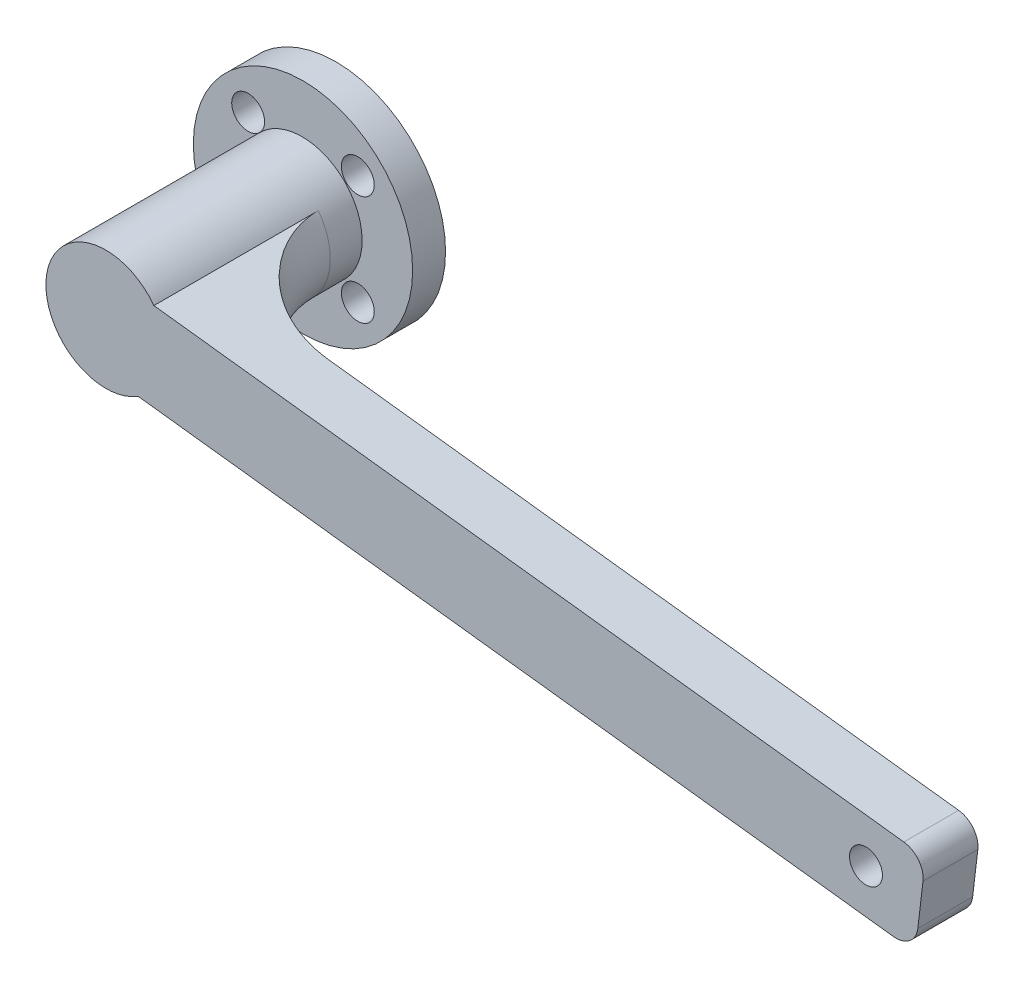
ISO-10303-21;
HEADER;
FILE_DESCRIPTION(('STEP AP214'),'2;1');
FILE_NAME('part.step','',(''),(''),'','','');
FILE_SCHEMA(('AUTOMOTIVE_DESIGN { 1 0 10303 214 1 1 1 1 }'));
ENDSEC;
DATA;
#1=APPLICATION_CONTEXT('core data for automotive mechanical design processes');
#2=APPLICATION_PROTOCOL_DEFINITION('international standard','automotive_design',2000,#1);
#3=PRODUCT_CONTEXT('',#1,'mechanical');
#4=PRODUCT('Part','Part','',(#3));
#5=PRODUCT_RELATED_PRODUCT_CATEGORY('part','',(#4));
#6=PRODUCT_DEFINITION_FORMATION('','',#4);
#7=PRODUCT_DEFINITION_CONTEXT('part definition',#1,'design');
#8=PRODUCT_DEFINITION('design','',#6,#7);
#9=PRODUCT_DEFINITION_SHAPE('','',#8);
#10=(LENGTH_UNIT() NAMED_UNIT(*) SI_UNIT(.MILLI.,.METRE.));
#11=(NAMED_UNIT(*) PLANE_ANGLE_UNIT() SI_UNIT($,.RADIAN.));
#12=(NAMED_UNIT(*) SI_UNIT($,.STERADIAN.) SOLID_ANGLE_UNIT());
#13=UNCERTAINTY_MEASURE_WITH_UNIT(LENGTH_MEASURE(1.E-05),#10,'distance_accuracy_value','');
#14=(GEOMETRIC_REPRESENTATION_CONTEXT(3) GLOBAL_UNCERTAINTY_ASSIGNED_CONTEXT((#13)) GLOBAL_UNIT_ASSIGNED_CONTEXT((#10,
#11,#12)) REPRESENTATION_CONTEXT('',''));
#15=CARTESIAN_POINT('',(0.,0.,0.));
#16=DIRECTION('',(0.,0.,1.));
#17=DIRECTION('',(1.,0.,0.));
#18=AXIS2_PLACEMENT_3D('',#15,#16,#17);
#19=CARTESIAN_POINT('',(73.7243678529895,-13.0027267958765,20.9));
#20=DIRECTION('',(0.118573999040063,0.992945218404141,0.));
#21=DIRECTION('',(-0.992945218404141,0.118573999040063,0.));
#22=AXIS2_PLACEMENT_3D('',#19,#20,#21);
#23=PLANE('',#22);
#24=DIRECTION('',(0.992945218404141,-0.118573999040063,0.));
#25=VECTOR('',#24,1.);
#26=CARTESIAN_POINT('',(73.7243678529895,-13.0027267958765,15.9));
#27=LINE('',#26,#25);
#28=CARTESIAN_POINT('',(14.1936143028368,-5.89377518054482,15.9));
#29=VERTEX_POINT('',#28);
#30=CARTESIAN_POINT('',(71.7384774161812,-12.7655787977964,15.9));
#31=VERTEX_POINT('',#30);
#32=EDGE_CURVE('E147',#29,#31,#27,.T.);
#33=ORIENTED_EDGE('',*,*,#32,.T.);
#34=DIRECTION('',(0.,0.,-1.));
#35=VECTOR('',#34,1.);
#36=CARTESIAN_POINT('',(71.7384774161812,-12.7655787977964,20.9));
#37=LINE('',#36,#35);
#38=CARTESIAN_POINT('',(71.7384774161812,-12.7655787977964,20.9));
#39=VERTEX_POINT('',#38);
#40=EDGE_CURVE('E69',#31,#39,#37,.F.);
#41=ORIENTED_EDGE('',*,*,#40,.T.);
#42=DIRECTION('',(0.992945218404141,-0.118573999040063,0.));
#43=VECTOR('',#42,1.);
#44=CARTESIAN_POINT('',(73.7243678529895,-13.0027267958765,20.9));
#45=LINE('',#44,#43);
#46=CARTESIAN_POINT('',(2.85567574392011,-4.53983873885273,20.9));
#47=VERTEX_POINT('',#46);
#48=EDGE_CURVE('E148',#47,#39,#45,.T.);
#49=ORIENTED_EDGE('',*,*,#48,.F.);
#50=DIRECTION('',(0.,0.,-1.));
#51=VECTOR('',#50,1.);
#52=CARTESIAN_POINT('',(2.85567574392011,-4.53983873885273,20.9));
#53=LINE('',#52,#51);
#54=CARTESIAN_POINT('',(2.85567574392011,-4.53983873885273,5.9));
#55=VERTEX_POINT('',#54);
#56=EDGE_CURVE('E127',#47,#55,#53,.T.);
#57=ORIENTED_EDGE('',*,*,#56,.T.);
#58=CARTESIAN_POINT('',(2.85567574392011,-4.53983873885273,5.9));
#59=CARTESIAN_POINT('',(2.85565488982125,-4.53983624853015,6.01813027048152));
#60=CARTESIAN_POINT('',(2.85896195703372,-4.5402311667766,6.13625213066155));
#61=CARTESIAN_POINT('',(2.87207510568197,-4.54179709251592,6.37209659921898));
#62=CARTESIAN_POINT('',(2.88187931893735,-4.5429678769173,6.48981931258924));
#63=CARTESIAN_POINT('',(2.90779078316281,-4.54606213214634,6.72419574855297));
#64=CARTESIAN_POINT('',(2.92387884624948,-4.54798331162496,6.84085162936946));
#65=CARTESIAN_POINT('',(2.96207581693861,-4.55254465849675,7.07315356877778));
#66=CARTESIAN_POINT('',(2.98418509364639,-4.55518486996717,7.18879956501419));
#67=CARTESIAN_POINT('',(3.05842990904725,-4.56405092270291,7.53097660543218));
#68=CARTESIAN_POINT('',(3.11882845475198,-4.57126350298193,7.75572868845713));
#69=CARTESIAN_POINT('',(3.2589609610075,-4.58799763025728,8.19912069548533));
#70=CARTESIAN_POINT('',(3.33871257606252,-4.59752128549194,8.41775483422706));
#71=CARTESIAN_POINT('',(3.53888361467139,-4.62142500152775,8.90705993691699));
#72=CARTESIAN_POINT('',(3.66445923199242,-4.63642079671533,9.17558931766199));
#73=CARTESIAN_POINT('',(3.93795752448287,-4.66908099354205,9.70074842096351));
#74=CARTESIAN_POINT('',(4.08588336376432,-4.68674577302822,9.957376451917));
#75=CARTESIAN_POINT('',(4.40191352679122,-4.72448497510385,10.4598278808813));
#76=CARTESIAN_POINT('',(4.57013397332511,-4.74457326466517,10.7055769277483));
#77=CARTESIAN_POINT('',(4.92385972870574,-4.78681394078863,11.1840467726426));
#78=CARTESIAN_POINT('',(5.10936370378799,-4.80896616807734,11.4167685737633));
#79=CARTESIAN_POINT('',(5.50449600633021,-4.85615146732038,11.8782166634284));
#80=CARTESIAN_POINT('',(5.71481914617973,-4.88126751130788,12.1063394820369));
#81=CARTESIAN_POINT('',(6.15134677173652,-4.93339609332263,12.5466127724936));
#82=CARTESIAN_POINT('',(6.37755143820309,-4.96040865293551,12.7587630624898));
#83=CARTESIAN_POINT('',(6.84427637564989,-5.01614329091859,13.1654907284742));
#84=CARTESIAN_POINT('',(7.08476792137296,-5.04486193902039,13.3601015094993));
#85=CARTESIAN_POINT('',(7.57936863702914,-5.10392540364705,13.7309017884578));
#86=CARTESIAN_POINT('',(7.83347790694515,-5.13427023211153,13.9070911511109));
#87=CARTESIAN_POINT('',(8.39395705735467,-5.20120066594699,14.2651113408204));
#88=CARTESIAN_POINT('',(8.70238208352981,-5.23803168953195,14.4436955320466));
#89=CARTESIAN_POINT('',(9.33366168455386,-5.313416862267,14.7724411251712));
#90=CARTESIAN_POINT('',(9.65650991570208,-5.35197025387483,14.9226148735095));
#91=CARTESIAN_POINT('',(10.3144443119947,-5.43053844779777,15.1926661759601));
#92=CARTESIAN_POINT('',(10.6495286074745,-5.47055302684415,15.312548336626));
#93=CARTESIAN_POINT('',(11.3291875778743,-5.5517154924163,15.5202240885454));
#94=CARTESIAN_POINT('',(11.6737576073646,-5.59286282420131,15.6080330965434));
#95=CARTESIAN_POINT('',(12.3791479856267,-5.67709804330972,15.7520664179887));
#96=CARTESIAN_POINT('',(12.7401558628045,-5.72020832461078,15.8073733372982));
#97=CARTESIAN_POINT('',(13.2840706187405,-5.78516069716148,15.8628436521518));
#98=CARTESIAN_POINT('',(13.46568499584,-5.80684844244361,15.8767519848374));
#99=CARTESIAN_POINT('',(13.8293926835084,-5.85028112554547,15.8953306744714));
#100=CARTESIAN_POINT('',(14.0114860306302,-5.87202606773022,15.9000003045957));
#101=CARTESIAN_POINT('',(14.1936143028368,-5.89377518054483,15.9));
#102=B_SPLINE_CURVE_WITH_KNOTS('',3,(#58,#59,#60,#61,#62,#63,#64,#65,#66,#67,#68,#69,#70,#71,
#72,#73,#74,#75,#76,#77,#78,#79,#80,#81,#82,#83,#84,#85,#86,#87,#88,#89,#90,#91,#92,#93,#94,#95,
#96,#97,#98,#99,#100,#101),.UNSPECIFIED.,.F.,.F.,(4,2,2,2,2,2,2,2,2,2,2,2,2,2,2,2,2,2,2,2,2,4),
(0.,0.35433002620435,0.70855821302277,1.06171310694,1.41488965441639,2.11227742770508,
2.81030378843708,3.69943989617541,4.5887019967054,5.48331789994667,6.37786482304914,
7.31092791740774,8.24400163336507,9.17525894482701,10.1065230946249,11.1799879735398,
12.2529852755138,13.3258193044912,14.3981369688331,15.4994247619345,16.0495210920058,
16.5996606973425),.UNSPECIFIED.);
#103=EDGE_CURVE('E220',#55,#29,#102,.T.);
#104=ORIENTED_EDGE('',*,*,#103,.T.);
#105=EDGE_LOOP('',(#33,#41,#49,#57,#104));
#106=FACE_BOUND('',#105,.T.);
#107=ADVANCED_FACE('F45',(#106),#23,.F.);
#108=CARTESIAN_POINT('',(74.67295984531,-5.05916504864342,20.9));
#109=DIRECTION('',(-0.118573999040062,-0.992945218404141,0.));
#110=DIRECTION('',(0.992945218404141,-0.118573999040062,0.));
#111=AXIS2_PLACEMENT_3D('',#108,#109,#110);
#112=PLANE('',#111);
#113=DIRECTION('',(-0.992945218404141,0.118573999040062,0.));
#114=VECTOR('',#113,1.);
#115=CARTESIAN_POINT('',(74.67295984531,-5.05916504864342,20.9));
#116=LINE('',#115,#114);
#117=CARTESIAN_POINT('',(72.6870694085017,-4.82201705056329,20.9));
#118=VERTEX_POINT('',#117);
#119=CARTESIAN_POINT('',(4.30589720479447,3.34382019499214,20.9));
#120=VERTEX_POINT('',#119);
#121=EDGE_CURVE('E109',#118,#120,#116,.T.);
#122=ORIENTED_EDGE('',*,*,#121,.F.);
#123=DIRECTION('',(0.,0.,-1.));
#124=VECTOR('',#123,1.);
#125=CARTESIAN_POINT('',(72.6870694085017,-4.82201705056329,20.9));
#126=LINE('',#125,#124);
#127=CARTESIAN_POINT('',(72.6870694085017,-4.82201705056329,15.9));
#128=VERTEX_POINT('',#127);
#129=EDGE_CURVE('E11',#118,#128,#126,.T.);
#130=ORIENTED_EDGE('',*,*,#129,.T.);
#131=DIRECTION('',(-0.992945218404141,0.118573999040062,0.));
#132=VECTOR('',#131,1.);
#133=CARTESIAN_POINT('',(74.67295984531,-5.05916504864342,15.9));
#134=LINE('',#133,#132);
#135=CARTESIAN_POINT('',(15.2667628880812,2.03491245978281,15.9));
#136=VERTEX_POINT('',#135);
#137=EDGE_CURVE('E151',#128,#136,#134,.T.);
#138=ORIENTED_EDGE('',*,*,#137,.T.);
#139=CARTESIAN_POINT('',(15.2667628880812,2.03491245978282,15.9));
#140=CARTESIAN_POINT('',(15.1027710270126,2.05449578665373,15.9000001400129));
#141=CARTESIAN_POINT('',(14.9388047288608,2.07407606089172,15.8961503374753));
#142=CARTESIAN_POINT('',(14.6112335794735,2.11319344665791,15.8808110252182));
#143=CARTESIAN_POINT('',(14.4476287087492,2.13273056051339,15.869321938035));
#144=CARTESIAN_POINT('',(13.9579858559919,2.19120197472305,15.8235032747055));
#145=CARTESIAN_POINT('',(13.6329266846673,2.2300193889713,15.7778221511562));
#146=CARTESIAN_POINT('',(12.9897312094758,2.30682751317024,15.6572480899694));
#147=CARTESIAN_POINT('',(12.6715708922033,2.34482109071673,15.5824834490408));
#148=CARTESIAN_POINT('',(12.0431005722038,2.41987078906775,15.4047643494211));
#149=CARTESIAN_POINT('',(11.7327906187127,2.45692690399273,15.3018097139761));
#150=CARTESIAN_POINT('',(11.1432902206934,2.52732295236807,15.0769653237763));
#151=CARTESIAN_POINT('',(10.8634257051431,2.56074338099106,14.9568602327722));
#152=CARTESIAN_POINT('',(10.3140849457068,2.62634370765033,14.6943900737811));
#153=CARTESIAN_POINT('',(10.0446118746368,2.65852322680016,14.5520182731499));
#154=CARTESIAN_POINT('',(9.51757654862432,2.72145991764915,14.2462160066592));
#155=CARTESIAN_POINT('',(9.26001936448255,2.75221648381125,14.0827766855252));
#156=CARTESIAN_POINT('',(8.75822951910725,2.81213844883111,13.7361025527693));
#157=CARTESIAN_POINT('',(8.51400318013423,2.84130309270692,13.5528584692582));
#158=CARTESIAN_POINT('',(8.0254664464734,2.89964241809411,13.1558741209048));
#159=CARTESIAN_POINT('',(7.78210971332536,2.92870321672413,12.9409424250678));
#160=CARTESIAN_POINT('',(7.31371602967353,2.98463713046508,12.4918946277917));
#161=CARTESIAN_POINT('',(7.08867166273334,3.01151113122055,12.2577863706463));
#162=CARTESIAN_POINT('',(6.65819578802088,3.06291703459653,11.7714831144335));
#163=CARTESIAN_POINT('',(6.45278567907855,3.0874463818446,11.5192688945944));
#164=CARTESIAN_POINT('',(6.06382518953538,3.13389466505185,10.9983229017347));
#165=CARTESIAN_POINT('',(5.88026927722495,3.15581426158818,10.7295953347755));
#166=CARTESIAN_POINT('',(5.57556632981962,3.19220080771729,10.2381669580064));
#167=CARTESIAN_POINT('',(5.44960833604761,3.20724226494553,10.0184823511));
#168=CARTESIAN_POINT('',(5.21399301442344,3.23537861164649,9.5703665011118));
#169=CARTESIAN_POINT('',(5.10433578785139,3.24847348902471,9.34193520369614));
#170=CARTESIAN_POINT('',(4.90370075153291,3.27243261402263,8.87798928483589));
#171=CARTESIAN_POINT('',(4.81264765514013,3.28330585210683,8.64250781943495));
#172=CARTESIAN_POINT('',(4.6509839017644,3.30261116460775,8.16455275593274));
#173=CARTESIAN_POINT('',(4.58036394083078,3.31104435006929,7.9220823956096));
#174=CARTESIAN_POINT('',(4.48618307717183,3.32229109503578,7.53187089233596));
#175=CARTESIAN_POINT('',(4.4551858687249,3.32599267181616,7.38592169237853));
#176=CARTESIAN_POINT('',(4.40163466723265,3.33238756651593,7.09248300227097));
#177=CARTESIAN_POINT('',(4.37907849989872,3.33508114408116,6.94499391884771));
#178=CARTESIAN_POINT('',(4.34271076952671,3.33942404955701,6.64825000912473));
#179=CARTESIAN_POINT('',(4.32893891984034,3.3410686350399,6.49899022826387));
#180=CARTESIAN_POINT('',(4.31051501373336,3.34326875261391,6.19982463134472));
#181=CARTESIAN_POINT('',(4.30586771686662,3.34382371633598,6.04991851898091));
#182=CARTESIAN_POINT('',(4.30589720479448,3.34382019499214,5.9));
#183=B_SPLINE_CURVE_WITH_KNOTS('',3,(#139,#140,#141,#142,#143,#144,#145,#146,#147,#148,#149,
#150,#151,#152,#153,#154,#155,#156,#157,#158,#159,#160,#161,#162,#163,#164,#165,#166,#167,#168,
#169,#170,#171,#172,#173,#174,#175,#176,#177,#178,#179,#180,#181,#182),.UNSPECIFIED.,.F.,.F.,(4,
2,2,2,2,2,2,2,2,2,2,2,2,2,2,2,2,2,2,2,2,4),(0.,0.495376044349954,0.990724691246001,
1.98084127002972,2.9666387730735,3.95244245730121,4.87058380859971,5.78900331112663,
6.70781011788869,7.6270489562137,8.60388816013682,9.58032975834077,10.5578237005323,
11.5350696921641,12.295498166296,13.0559313649327,13.8132235009535,14.5701702696717,
15.0177048343314,15.4651240411602,15.914551927387,16.3642141822003),.UNSPECIFIED.);
#184=CARTESIAN_POINT('',(4.30589720479447,3.34382019499214,5.9));
#185=VERTEX_POINT('',#184);
#186=EDGE_CURVE('E132',#136,#185,#183,.T.);
#187=ORIENTED_EDGE('',*,*,#186,.T.);
#188=DIRECTION('',(0.,0.,-1.));
#189=VECTOR('',#188,1.);
#190=CARTESIAN_POINT('',(4.30589720479447,3.34382019499214,20.9));
#191=LINE('',#190,#189);
#192=EDGE_CURVE('E125',#120,#185,#191,.T.);
#193=ORIENTED_EDGE('',*,*,#192,.F.);
#194=EDGE_LOOP('',(#122,#130,#138,#187,#193));
#195=FACE_BOUND('',#194,.T.);
#196=ADVANCED_FACE('F130',(#195),#112,.F.);
#197=CARTESIAN_POINT('',(0.,0.,3.));
#198=DIRECTION('',(0.,0.,-1.));
#199=DIRECTION('',(-1.,0.,0.));
#200=AXIS2_PLACEMENT_3D('',#197,#198,#199);
#201=CYLINDRICAL_SURFACE('',#200,10.);
#202=CARTESIAN_POINT('',(0.,0.,3.));
#203=DIRECTION('',(0.,0.,1.));
#204=DIRECTION('',(1.,0.,0.));
#205=AXIS2_PLACEMENT_3D('',#202,#203,#204);
#206=CIRCLE('',#205,10.);
#207=CARTESIAN_POINT('',(10.,0.,3.));
#208=VERTEX_POINT('',#207);
#209=EDGE_CURVE('E198',#208,#208,#206,.T.);
#210=ORIENTED_EDGE('',*,*,#209,.F.);
#211=EDGE_LOOP('',(#210));
#212=FACE_BOUND('',#211,.T.);
#213=CARTESIAN_POINT('',(0.,0.,0.));
#214=DIRECTION('',(0.,0.,1.));
#215=DIRECTION('',(1.,0.,0.));
#216=AXIS2_PLACEMENT_3D('',#213,#214,#215);
#217=CIRCLE('',#216,10.);
#218=CARTESIAN_POINT('',(10.,0.,0.));
#219=VERTEX_POINT('',#218);
#220=EDGE_CURVE('E194',#219,#219,#217,.T.);
#221=ORIENTED_EDGE('',*,*,#220,.T.);
#222=EDGE_LOOP('',(#221));
#223=FACE_BOUND('',#222,.T.);
#224=ADVANCED_FACE('F237',(#212,#223),#201,.T.);
#225=CARTESIAN_POINT('',(0.,0.,3.));
#226=DIRECTION('',(0.,0.,1.));
#227=DIRECTION('',(1.,0.,0.));
#228=AXIS2_PLACEMENT_3D('',#225,#226,#227);
#229=PLANE('',#228);
#230=CARTESIAN_POINT('',(5.,5.,3.));
#231=DIRECTION('',(0.,0.,1.));
#232=DIRECTION('',(1.,0.,0.));
#233=AXIS2_PLACEMENT_3D('',#230,#231,#232);
#234=CIRCLE('',#233,1.5);
#235=CARTESIAN_POINT('',(6.5,5.,3.));
#236=VERTEX_POINT('',#235);
#237=EDGE_CURVE('E174',#236,#236,#234,.T.);
#238=ORIENTED_EDGE('',*,*,#237,.F.);
#239=EDGE_LOOP('',(#238));
#240=FACE_BOUND('',#239,.T.);
#241=CARTESIAN_POINT('',(-5.,-5.,3.));
#242=DIRECTION('',(0.,0.,1.));
#243=DIRECTION('',(1.,0.,0.));
#244=AXIS2_PLACEMENT_3D('',#241,#242,#243);
#245=CIRCLE('',#244,1.5);
#246=CARTESIAN_POINT('',(-3.5,-5.,3.));
#247=VERTEX_POINT('',#246);
#248=EDGE_CURVE('E183',#247,#247,#245,.T.);
#249=ORIENTED_EDGE('',*,*,#248,.F.);
#250=EDGE_LOOP('',(#249));
#251=FACE_BOUND('',#250,.T.);
#252=CARTESIAN_POINT('',(5.,-5.,3.));
#253=DIRECTION('',(0.,0.,1.));
#254=DIRECTION('',(1.,0.,0.));
#255=AXIS2_PLACEMENT_3D('',#252,#253,#254);
#256=CIRCLE('',#255,1.5);
#257=CARTESIAN_POINT('',(6.5,-5.,3.));
#258=VERTEX_POINT('',#257);
#259=EDGE_CURVE('E166',#258,#258,#256,.T.);
#260=ORIENTED_EDGE('',*,*,#259,.F.);
#261=EDGE_LOOP('',(#260));
#262=FACE_BOUND('',#261,.T.);
#263=CARTESIAN_POINT('',(-5.,5.,3.));
#264=DIRECTION('',(0.,0.,1.));
#265=DIRECTION('',(1.,0.,0.));
#266=AXIS2_PLACEMENT_3D('',#263,#264,#265);
#267=CIRCLE('',#266,1.5);
#268=CARTESIAN_POINT('',(-3.93933982822018,3.93933982822018,3.));
#269=VERTEX_POINT('',#268);
#270=EDGE_CURVE('E178',#269,#269,#267,.T.);
#271=ORIENTED_EDGE('',*,*,#270,.F.);
#272=CARTESIAN_POINT('',(-0.0743665038723598,0.0743665038723598,3.));
#273=DIRECTION('',(0.,0.,1.));
#274=DIRECTION('',(1.,0.,0.));
#275=AXIS2_PLACEMENT_3D('',#272,#273,#274);
#276=CIRCLE('',#275,5.46589769350291);
#277=EDGE_CURVE('E118',#269,#269,#276,.T.);
#278=ORIENTED_EDGE('',*,*,#277,.F.);
#279=EDGE_LOOP('',(#271,#278));
#280=FACE_BOUND('',#279,.T.);
#281=ORIENTED_EDGE('',*,*,#209,.T.);
#282=EDGE_LOOP('',(#281));
#283=FACE_BOUND('',#282,.T.);
#284=ADVANCED_FACE('F274',(#240,#251,#262,#280,#283),#229,.T.);
#285=CARTESIAN_POINT('',(0.,0.,0.));
#286=DIRECTION('',(0.,0.,1.));
#287=DIRECTION('',(1.,0.,0.));
#288=AXIS2_PLACEMENT_3D('',#285,#286,#287);
#289=PLANE('',#288);
#290=CARTESIAN_POINT('',(5.,5.,0.));
#291=DIRECTION('',(0.,0.,1.));
#292=DIRECTION('',(1.,0.,0.));
#293=AXIS2_PLACEMENT_3D('',#290,#291,#292);
#294=CIRCLE('',#293,1.5);
#295=CARTESIAN_POINT('',(6.5,5.,0.));
#296=VERTEX_POINT('',#295);
#297=EDGE_CURVE('E179',#296,#296,#294,.T.);
#298=ORIENTED_EDGE('',*,*,#297,.T.);
#299=EDGE_LOOP('',(#298));
#300=FACE_BOUND('',#299,.T.);
#301=CARTESIAN_POINT('',(-5.,-5.,0.));
#302=DIRECTION('',(0.,0.,1.));
#303=DIRECTION('',(1.,0.,0.));
#304=AXIS2_PLACEMENT_3D('',#301,#302,#303);
#305=CIRCLE('',#304,1.5);
#306=CARTESIAN_POINT('',(-3.5,-5.,0.));
#307=VERTEX_POINT('',#306);
#308=EDGE_CURVE('E170',#307,#307,#305,.T.);
#309=ORIENTED_EDGE('',*,*,#308,.T.);
#310=EDGE_LOOP('',(#309));
#311=FACE_BOUND('',#310,.T.);
#312=CARTESIAN_POINT('',(5.,-5.,0.));
#313=DIRECTION('',(0.,0.,1.));
#314=DIRECTION('',(1.,0.,0.));
#315=AXIS2_PLACEMENT_3D('',#312,#313,#314);
#316=CIRCLE('',#315,1.5);
#317=CARTESIAN_POINT('',(6.5,-5.,0.));
#318=VERTEX_POINT('',#317);
#319=EDGE_CURVE('E165',#318,#318,#316,.T.);
#320=ORIENTED_EDGE('',*,*,#319,.T.);
#321=EDGE_LOOP('',(#320));
#322=FACE_BOUND('',#321,.T.);
#323=CARTESIAN_POINT('',(-5.,5.,0.));
#324=DIRECTION('',(0.,0.,1.));
#325=DIRECTION('',(1.,0.,0.));
#326=AXIS2_PLACEMENT_3D('',#323,#324,#325);
#327=CIRCLE('',#326,1.5);
#328=CARTESIAN_POINT('',(-3.5,5.,0.));
#329=VERTEX_POINT('',#328);
#330=EDGE_CURVE('E190',#329,#329,#327,.T.);
#331=ORIENTED_EDGE('',*,*,#330,.T.);
#332=EDGE_LOOP('',(#331));
#333=FACE_BOUND('',#332,.T.);
#334=ORIENTED_EDGE('',*,*,#220,.F.);
#335=EDGE_LOOP('',(#334));
#336=FACE_BOUND('',#335,.T.);
#337=ADVANCED_FACE('F272',(#300,#311,#322,#333,#336),#289,.F.);
#338=CARTESIAN_POINT('',(-5.,5.,0.));
#339=DIRECTION('',(0.,0.,1.));
#340=DIRECTION('',(1.,0.,0.));
#341=AXIS2_PLACEMENT_3D('',#338,#339,#340);
#342=CYLINDRICAL_SURFACE('',#341,1.5);
#343=ORIENTED_EDGE('',*,*,#330,.F.);
#344=EDGE_LOOP('',(#343));
#345=FACE_BOUND('',#344,.T.);
#346=ORIENTED_EDGE('',*,*,#270,.T.);
#347=EDGE_LOOP('',(#346));
#348=FACE_BOUND('',#347,.T.);
#349=ADVANCED_FACE('F262',(#345,#348),#342,.F.);
#350=CARTESIAN_POINT('',(5.,-5.,0.));
#351=DIRECTION('',(0.,0.,1.));
#352=DIRECTION('',(1.,0.,0.));
#353=AXIS2_PLACEMENT_3D('',#350,#351,#352);
#354=CYLINDRICAL_SURFACE('',#353,1.5);
#355=ORIENTED_EDGE('',*,*,#319,.F.);
#356=EDGE_LOOP('',(#355));
#357=FACE_BOUND('',#356,.T.);
#358=ORIENTED_EDGE('',*,*,#259,.T.);
#359=EDGE_LOOP('',(#358));
#360=FACE_BOUND('',#359,.T.);
#361=ADVANCED_FACE('F258',(#357,#360),#354,.F.);
#362=CARTESIAN_POINT('',(-5.,-5.,0.));
#363=DIRECTION('',(0.,0.,1.));
#364=DIRECTION('',(1.,0.,0.));
#365=AXIS2_PLACEMENT_3D('',#362,#363,#364);
#366=CYLINDRICAL_SURFACE('',#365,1.5);
#367=ORIENTED_EDGE('',*,*,#308,.F.);
#368=EDGE_LOOP('',(#367));
#369=FACE_BOUND('',#368,.T.);
#370=ORIENTED_EDGE('',*,*,#248,.T.);
#371=EDGE_LOOP('',(#370));
#372=FACE_BOUND('',#371,.T.);
#373=ADVANCED_FACE('F261',(#369,#372),#366,.F.);
#374=CARTESIAN_POINT('',(5.,5.,0.));
#375=DIRECTION('',(0.,0.,1.));
#376=DIRECTION('',(1.,0.,0.));
#377=AXIS2_PLACEMENT_3D('',#374,#375,#376);
#378=CYLINDRICAL_SURFACE('',#377,1.5);
#379=ORIENTED_EDGE('',*,*,#297,.F.);
#380=EDGE_LOOP('',(#379));
#381=FACE_BOUND('',#380,.T.);
#382=ORIENTED_EDGE('',*,*,#237,.T.);
#383=EDGE_LOOP('',(#382));
#384=FACE_BOUND('',#383,.T.);
#385=ADVANCED_FACE('F257',(#381,#384),#378,.F.);
#386=CARTESIAN_POINT('',(-0.0743665038723598,0.0743665038723598,15.9));
#387=DIRECTION('',(0.,0.,-1.));
#388=DIRECTION('',(-1.,0.,0.));
#389=AXIS2_PLACEMENT_3D('',#386,#387,#388);
#390=CYLINDRICAL_SURFACE('',#389,5.46589769350291);
#391=ORIENTED_EDGE('',*,*,#192,.T.);
#392=CARTESIAN_POINT('',(-0.0743665038723598,0.0743665038723598,5.9));
#393=DIRECTION('',(0.,0.,1.));
#394=DIRECTION('',(1.,0.,0.));
#395=AXIS2_PLACEMENT_3D('',#392,#393,#394);
#396=CIRCLE('',#395,5.46589769350291);
#397=EDGE_CURVE('E209',#185,#55,#396,.F.);
#398=ORIENTED_EDGE('',*,*,#397,.T.);
#399=ORIENTED_EDGE('',*,*,#56,.F.);
#400=CARTESIAN_POINT('',(-0.0743665038723598,0.0743665038723598,20.9));
#401=DIRECTION('',(0.,0.,1.));
#402=DIRECTION('',(1.,0.,0.));
#403=AXIS2_PLACEMENT_3D('',#400,#401,#402);
#404=CIRCLE('',#403,5.46589769350291);
#405=EDGE_CURVE('E113',#120,#47,#404,.T.);
#406=ORIENTED_EDGE('',*,*,#405,.F.);
#407=EDGE_LOOP('',(#391,#398,#399,#406));
#408=FACE_BOUND('',#407,.T.);
#409=ORIENTED_EDGE('',*,*,#277,.T.);
#410=EDGE_LOOP('',(#409));
#411=FACE_BOUND('',#410,.T.);
#412=ADVANCED_FACE('F122',(#408,#411),#390,.T.);
#413=CARTESIAN_POINT('',(0.,0.,15.9));
#414=DIRECTION('',(0.,0.,1.));
#415=DIRECTION('',(1.,0.,0.));
#416=AXIS2_PLACEMENT_3D('',#413,#414,#415);
#417=PLANE('',#416);
#418=CARTESIAN_POINT('',(69.233937757129,-8.43807592705971,15.9));
#419=DIRECTION('',(0.,0.,1.));
#420=DIRECTION('',(1.,0.,0.));
#421=AXIS2_PLACEMENT_3D('',#418,#419,#420);
#422=CIRCLE('',#421,1.5);
#423=CARTESIAN_POINT('',(70.733937757129,-8.43807592705971,15.9));
#424=VERTEX_POINT('',#423);
#425=EDGE_CURVE('E140',#424,#424,#422,.T.);
#426=ORIENTED_EDGE('',*,*,#425,.T.);
#427=EDGE_LOOP('',(#426));
#428=FACE_BOUND('',#427,.T.);
#429=DIRECTION('',(0.118573999040063,0.992945218404141,0.));
#430=VECTOR('',#429,1.);
#431=CARTESIAN_POINT('',(74.67295984531,-5.05916504864342,15.9));
#432=LINE('',#431,#430);
#433=CARTESIAN_POINT('',(73.9615158510696,-11.0168363590683,15.9));
#434=VERTEX_POINT('',#433);
#435=CARTESIAN_POINT('',(74.4358118472298,-7.0450554854517,15.9));
#436=VERTEX_POINT('',#435);
#437=EDGE_CURVE('E156',#434,#436,#432,.T.);
#438=ORIENTED_EDGE('',*,*,#437,.F.);
#439=CARTESIAN_POINT('',(71.9756254142613,-10.7796883609881,15.9));
#440=DIRECTION('',(0.,0.,1.));
#441=DIRECTION('',(1.,0.,0.));
#442=AXIS2_PLACEMENT_3D('',#439,#440,#441);
#443=CIRCLE('',#442,2.);
#444=EDGE_CURVE('E446',#434,#31,#443,.F.);
#445=ORIENTED_EDGE('',*,*,#444,.T.);
#446=ORIENTED_EDGE('',*,*,#32,.F.);
#447=CARTESIAN_POINT('',(-0.0743665038723598,0.0743665038723598,15.9));
#448=DIRECTION('',(0.,0.,1.));
#449=DIRECTION('',(1.,0.,0.));
#450=AXIS2_PLACEMENT_3D('',#447,#448,#449);
#451=CIRCLE('',#450,15.4658976935029);
#452=EDGE_CURVE('E202',#29,#136,#451,.T.);
#453=ORIENTED_EDGE('',*,*,#452,.T.);
#454=ORIENTED_EDGE('',*,*,#137,.F.);
#455=CARTESIAN_POINT('',(72.4499214104215,-6.80790748737158,15.9));
#456=DIRECTION('',(0.,0.,1.));
#457=DIRECTION('',(1.,0.,0.));
#458=AXIS2_PLACEMENT_3D('',#455,#456,#457);
#459=CIRCLE('',#458,2.);
#460=EDGE_CURVE('E448',#128,#436,#459,.F.);
#461=ORIENTED_EDGE('',*,*,#460,.T.);
#462=EDGE_LOOP('',(#438,#445,#446,#453,#454,#461));
#463=FACE_BOUND('',#462,.T.);
#464=ADVANCED_FACE('F256',(#428,#463),#417,.F.);
#465=CARTESIAN_POINT('',(74.67295984531,-5.05916504864342,20.9));
#466=DIRECTION('',(-0.992945218404141,0.118573999040063,0.));
#467=DIRECTION('',(-0.118573999040063,-0.992945218404141,0.));
#468=AXIS2_PLACEMENT_3D('',#465,#466,#467);
#469=PLANE('',#468);
#470=DIRECTION('',(0.118573999040063,0.992945218404141,0.));
#471=VECTOR('',#470,1.);
#472=CARTESIAN_POINT('',(74.67295984531,-5.05916504864342,20.9));
#473=LINE('',#472,#471);
#474=CARTESIAN_POINT('',(73.9615158510696,-11.0168363590683,20.9));
#475=VERTEX_POINT('',#474);
#476=CARTESIAN_POINT('',(74.4358118472298,-7.0450554854517,20.9));
#477=VERTEX_POINT('',#476);
#478=EDGE_CURVE('E119',#475,#477,#473,.T.);
#479=ORIENTED_EDGE('',*,*,#478,.F.);
#480=DIRECTION('',(0.,0.,-1.));
#481=VECTOR('',#480,1.);
#482=CARTESIAN_POINT('',(73.9615158510696,-11.0168363590683,20.9));
#483=LINE('',#482,#481);
#484=EDGE_CURVE('E442',#475,#434,#483,.T.);
#485=ORIENTED_EDGE('',*,*,#484,.T.);
#486=ORIENTED_EDGE('',*,*,#437,.T.);
#487=DIRECTION('',(0.,0.,-1.));
#488=VECTOR('',#487,1.);
#489=CARTESIAN_POINT('',(74.4358118472298,-7.0450554854517,20.9));
#490=LINE('',#489,#488);
#491=EDGE_CURVE('E445',#436,#477,#490,.F.);
#492=ORIENTED_EDGE('',*,*,#491,.T.);
#493=EDGE_LOOP('',(#479,#485,#486,#492));
#494=FACE_BOUND('',#493,.T.);
#495=ADVANCED_FACE('F253',(#494),#469,.F.);
#496=CARTESIAN_POINT('',(0.,0.,20.9));
#497=DIRECTION('',(0.,0.,1.));
#498=DIRECTION('',(1.,0.,0.));
#499=AXIS2_PLACEMENT_3D('',#496,#497,#498);
#500=PLANE('',#499);
#501=ORIENTED_EDGE('',*,*,#48,.T.);
#502=CARTESIAN_POINT('',(71.9756254142613,-10.7796883609881,20.9));
#503=DIRECTION('',(0.,0.,1.));
#504=DIRECTION('',(1.,0.,0.));
#505=AXIS2_PLACEMENT_3D('',#502,#503,#504);
#506=CIRCLE('',#505,2.);
#507=EDGE_CURVE('E54',#39,#475,#506,.T.);
#508=ORIENTED_EDGE('',*,*,#507,.T.);
#509=ORIENTED_EDGE('',*,*,#478,.T.);
#510=CARTESIAN_POINT('',(72.4499214104215,-6.80790748737158,20.9));
#511=DIRECTION('',(0.,0.,1.));
#512=DIRECTION('',(1.,0.,0.));
#513=AXIS2_PLACEMENT_3D('',#510,#511,#512);
#514=CIRCLE('',#513,2.);
#515=EDGE_CURVE('E61',#477,#118,#514,.T.);
#516=ORIENTED_EDGE('',*,*,#515,.T.);
#517=ORIENTED_EDGE('',*,*,#121,.T.);
#518=ORIENTED_EDGE('',*,*,#405,.T.);
#519=EDGE_LOOP('',(#501,#508,#509,#516,#517,#518));
#520=FACE_BOUND('',#519,.T.);
#521=CARTESIAN_POINT('',(69.233937757129,-8.43807592705971,20.9));
#522=DIRECTION('',(0.,0.,1.));
#523=DIRECTION('',(1.,0.,0.));
#524=AXIS2_PLACEMENT_3D('',#521,#522,#523);
#525=CIRCLE('',#524,1.5);
#526=CARTESIAN_POINT('',(70.733937757129,-8.43807592705971,20.9));
#527=VERTEX_POINT('',#526);
#528=EDGE_CURVE('E135',#527,#527,#525,.T.);
#529=ORIENTED_EDGE('',*,*,#528,.F.);
#530=EDGE_LOOP('',(#529));
#531=FACE_BOUND('',#530,.T.);
#532=ADVANCED_FACE('F111',(#520,#531),#500,.T.);
#533=CARTESIAN_POINT('',(69.233937757129,-8.43807592705971,0.));
#534=DIRECTION('',(0.,0.,1.));
#535=DIRECTION('',(1.,0.,0.));
#536=AXIS2_PLACEMENT_3D('',#533,#534,#535);
#537=CYLINDRICAL_SURFACE('',#536,1.5);
#538=ORIENTED_EDGE('',*,*,#528,.T.);
#539=EDGE_LOOP('',(#538));
#540=FACE_BOUND('',#539,.T.);
#541=ORIENTED_EDGE('',*,*,#425,.F.);
#542=EDGE_LOOP('',(#541));
#543=FACE_BOUND('',#542,.T.);
#544=ADVANCED_FACE('F235',(#540,#543),#537,.F.);
#545=CARTESIAN_POINT('',(-0.0743665038723598,0.0743665038723598,5.9));
#546=DIRECTION('',(0.,0.,1.));
#547=DIRECTION('',(1.,0.,0.));
#548=AXIS2_PLACEMENT_3D('',#545,#546,#547);
#549=TOROIDAL_SURFACE('',#548,15.4658976935029,10.);
#550=ORIENTED_EDGE('',*,*,#103,.F.);
#551=ORIENTED_EDGE('',*,*,#397,.F.);
#552=ORIENTED_EDGE('',*,*,#186,.F.);
#553=ORIENTED_EDGE('',*,*,#452,.F.);
#554=EDGE_LOOP('',(#550,#551,#552,#553));
#555=FACE_BOUND('',#554,.T.);
#556=ADVANCED_FACE('F230',(#555),#549,.F.);
#557=CARTESIAN_POINT('',(71.9756254142613,-10.7796883609881,20.9));
#558=DIRECTION('',(0.,0.,-1.));
#559=DIRECTION('',(-1.,0.,0.));
#560=AXIS2_PLACEMENT_3D('',#557,#558,#559);
#561=CYLINDRICAL_SURFACE('',#560,2.);
#562=ORIENTED_EDGE('',*,*,#507,.F.);
#563=ORIENTED_EDGE('',*,*,#40,.F.);
#564=ORIENTED_EDGE('',*,*,#444,.F.);
#565=ORIENTED_EDGE('',*,*,#484,.F.);
#566=EDGE_LOOP('',(#562,#563,#564,#565));
#567=FACE_BOUND('',#566,.T.);
#568=ADVANCED_FACE('F234',(#567),#561,.T.);
#569=CARTESIAN_POINT('',(72.4499214104215,-6.80790748737158,20.9));
#570=DIRECTION('',(0.,0.,-1.));
#571=DIRECTION('',(-1.,0.,0.));
#572=AXIS2_PLACEMENT_3D('',#569,#570,#571);
#573=CYLINDRICAL_SURFACE('',#572,2.);
#574=ORIENTED_EDGE('',*,*,#515,.F.);
#575=ORIENTED_EDGE('',*,*,#491,.F.);
#576=ORIENTED_EDGE('',*,*,#460,.F.);
#577=ORIENTED_EDGE('',*,*,#129,.F.);
#578=EDGE_LOOP('',(#574,#575,#576,#577));
#579=FACE_BOUND('',#578,.T.);
#580=ADVANCED_FACE('F47',(#579),#573,.T.);
#581=CLOSED_SHELL('',(#107,#196,#224,#284,#337,#349,#361,#373,#385,#412,#464,#495,#532,#544,
#556,#568,#580));
#582=MANIFOLD_SOLID_BREP('B2',#581);
#583=ADVANCED_BREP_SHAPE_REPRESENTATION('',(#18,#582),#14);
#584=SHAPE_DEFINITION_REPRESENTATION(#9,#583);
ENDSEC;
END-ISO-10303-21;
